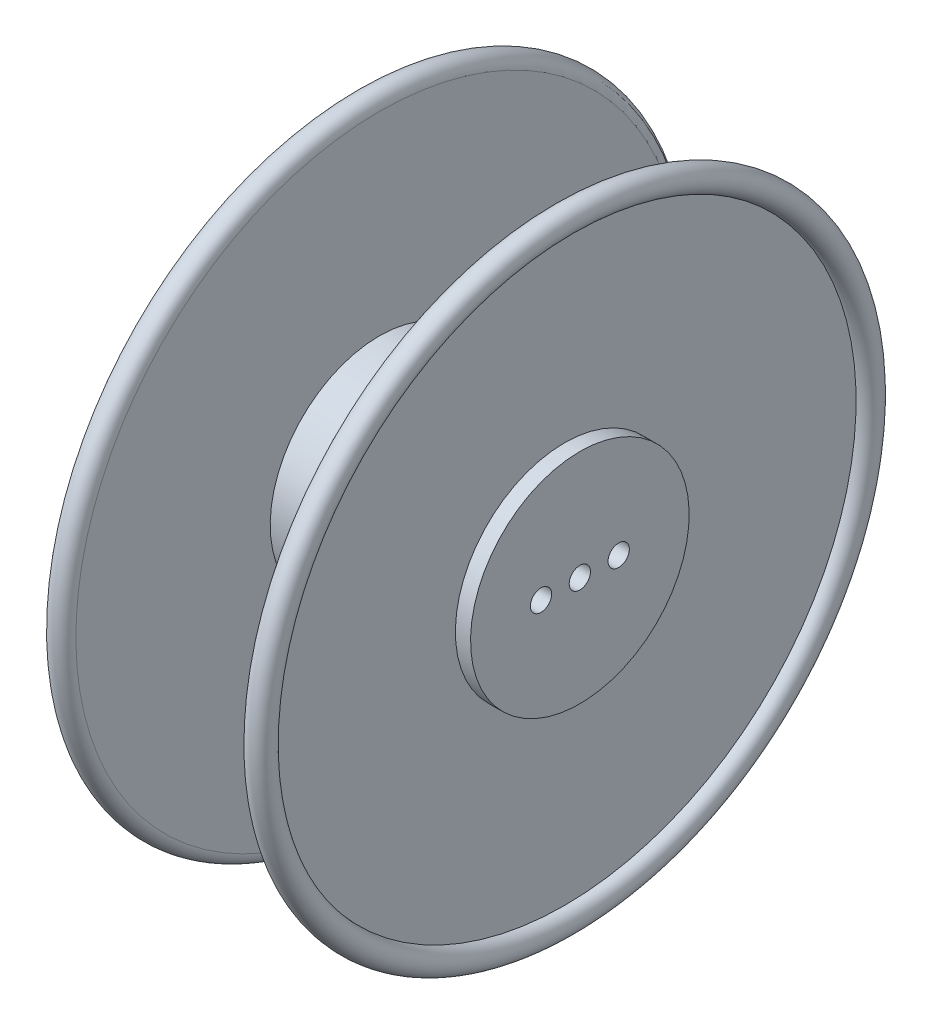
ISO-10303-21;
HEADER;
FILE_DESCRIPTION(('STEP AP214'),'2;1');
FILE_NAME('part.step','',(''),(''),'','','');
FILE_SCHEMA(('AUTOMOTIVE_DESIGN { 1 0 10303 214 1 1 1 1 }'));
ENDSEC;
DATA;
#1=APPLICATION_CONTEXT('core data for automotive mechanical design processes');
#2=APPLICATION_PROTOCOL_DEFINITION('international standard','automotive_design',2000,#1);
#3=PRODUCT_CONTEXT('',#1,'mechanical');
#4=PRODUCT('Part','Part','',(#3));
#5=PRODUCT_RELATED_PRODUCT_CATEGORY('part','',(#4));
#6=PRODUCT_DEFINITION_FORMATION('','',#4);
#7=PRODUCT_DEFINITION_CONTEXT('part definition',#1,'design');
#8=PRODUCT_DEFINITION('design','',#6,#7);
#9=PRODUCT_DEFINITION_SHAPE('','',#8);
#10=(LENGTH_UNIT() NAMED_UNIT(*) SI_UNIT(.MILLI.,.METRE.));
#11=(NAMED_UNIT(*) PLANE_ANGLE_UNIT() SI_UNIT($,.RADIAN.));
#12=(NAMED_UNIT(*) SI_UNIT($,.STERADIAN.) SOLID_ANGLE_UNIT());
#13=UNCERTAINTY_MEASURE_WITH_UNIT(LENGTH_MEASURE(1.E-05),#10,'distance_accuracy_value','');
#14=(GEOMETRIC_REPRESENTATION_CONTEXT(3) GLOBAL_UNCERTAINTY_ASSIGNED_CONTEXT((#13)) GLOBAL_UNIT_ASSIGNED_CONTEXT((#10,
#11,#12)) REPRESENTATION_CONTEXT('',''));
#15=CARTESIAN_POINT('',(0.,0.,0.));
#16=DIRECTION('',(0.,0.,1.));
#17=DIRECTION('',(1.,0.,0.));
#18=AXIS2_PLACEMENT_3D('',#15,#16,#17);
#19=CARTESIAN_POINT('',(19.9999999999994,-1.11022302462516E-13,0.));
#20=DIRECTION('',(1.,0.,0.));
#21=DIRECTION('',(0.,1.,0.));
#22=AXIS2_PLACEMENT_3D('',#19,#20,#21);
#23=TOROIDAL_SURFACE('',#22,500.,20.);
#24=CARTESIAN_POINT('',(19.9999999999995,0.,0.));
#25=DIRECTION('',(1.,0.,0.));
#26=DIRECTION('',(0.,1.,0.));
#27=AXIS2_PLACEMENT_3D('',#24,#25,#26);
#28=CIRCLE('',#27,480.);
#29=CARTESIAN_POINT('',(20.0000000000001,480.,0.));
#30=VERTEX_POINT('',#29);
#31=EDGE_CURVE('E72',#30,#30,#28,.T.);
#32=ORIENTED_EDGE('',*,*,#31,.F.);
#33=EDGE_LOOP('',(#32));
#34=FACE_BOUND('',#33,.T.);
#35=CARTESIAN_POINT('',(-6.17561557447743E-13,0.,0.));
#36=DIRECTION('',(1.,0.,0.));
#37=DIRECTION('',(0.,1.,0.));
#38=AXIS2_PLACEMENT_3D('',#35,#36,#37);
#39=CIRCLE('',#38,500.);
#40=CARTESIAN_POINT('',(0.,500.,0.));
#41=VERTEX_POINT('',#40);
#42=EDGE_CURVE('E10',#41,#41,#39,.T.);
#43=ORIENTED_EDGE('',*,*,#42,.T.);
#44=EDGE_LOOP('',(#43));
#45=FACE_BOUND('',#44,.T.);
#46=ADVANCED_FACE('F38',(#34,#45),#23,.T.);
#47=CARTESIAN_POINT('',(-4.19417587080614E-13,0.,0.));
#48=DIRECTION('',(1.,0.,0.));
#49=DIRECTION('',(0.,1.,0.));
#50=AXIS2_PLACEMENT_3D('',#47,#48,#49);
#51=PLANE('',#50);
#52=ORIENTED_EDGE('',*,*,#42,.F.);
#53=EDGE_LOOP('',(#52));
#54=FACE_BOUND('',#53,.T.);
#55=CARTESIAN_POINT('',(-2.22044604925031E-13,0.,0.));
#56=DIRECTION('',(1.,0.,0.));
#57=DIRECTION('',(0.,1.,0.));
#58=AXIS2_PLACEMENT_3D('',#55,#56,#57);
#59=CIRCLE('',#58,180.);
#60=CARTESIAN_POINT('',(0.,180.,0.));
#61=VERTEX_POINT('',#60);
#62=EDGE_CURVE('E44',#61,#61,#59,.T.);
#63=ORIENTED_EDGE('',*,*,#62,.T.);
#64=EDGE_LOOP('',(#63));
#65=FACE_BOUND('',#64,.T.);
#66=ADVANCED_FACE('F128',(#54,#65),#51,.F.);
#67=CARTESIAN_POINT('',(45.0000000000001,0.,0.));
#68=DIRECTION('',(1.,0.,0.));
#69=DIRECTION('',(0.,1.,0.));
#70=AXIS2_PLACEMENT_3D('',#67,#68,#69);
#71=CYLINDRICAL_SURFACE('',#70,180.);
#72=ORIENTED_EDGE('',*,*,#62,.F.);
#73=EDGE_LOOP('',(#72));
#74=FACE_BOUND('',#73,.T.);
#75=CARTESIAN_POINT('',(-285.,3.51570624464632E-13,0.));
#76=DIRECTION('',(1.,0.,0.));
#77=DIRECTION('',(0.,1.,0.));
#78=AXIS2_PLACEMENT_3D('',#75,#76,#77);
#79=CIRCLE('',#78,180.);
#80=CARTESIAN_POINT('',(-285.,180.,0.));
#81=VERTEX_POINT('',#80);
#82=EDGE_CURVE('E48',#81,#81,#79,.T.);
#83=ORIENTED_EDGE('',*,*,#82,.T.);
#84=EDGE_LOOP('',(#83));
#85=FACE_BOUND('',#84,.T.);
#86=ADVANCED_FACE('F132',(#74,#85),#71,.T.);
#87=CARTESIAN_POINT('',(-285.,0.,0.));
#88=DIRECTION('',(1.,0.,0.));
#89=DIRECTION('',(0.,1.,0.));
#90=AXIS2_PLACEMENT_3D('',#87,#88,#89);
#91=PLANE('',#90);
#92=CARTESIAN_POINT('',(-285.,3.51570624464633E-13,0.));
#93=DIRECTION('',(1.,0.,0.));
#94=DIRECTION('',(0.,1.,0.));
#95=AXIS2_PLACEMENT_3D('',#92,#93,#94);
#96=CIRCLE('',#95,500.);
#97=CARTESIAN_POINT('',(-285.,500.,0.));
#98=VERTEX_POINT('',#97);
#99=EDGE_CURVE('E52',#98,#98,#96,.T.);
#100=ORIENTED_EDGE('',*,*,#99,.T.);
#101=EDGE_LOOP('',(#100));
#102=FACE_BOUND('',#101,.T.);
#103=ORIENTED_EDGE('',*,*,#82,.F.);
#104=EDGE_LOOP('',(#103));
#105=FACE_BOUND('',#104,.T.);
#106=ADVANCED_FACE('F137',(#102,#105),#91,.T.);
#107=CARTESIAN_POINT('',(-305.000000000001,3.33066907387547E-13,0.));
#108=DIRECTION('',(1.,0.,0.));
#109=DIRECTION('',(0.,1.,0.));
#110=AXIS2_PLACEMENT_3D('',#107,#108,#109);
#111=TOROIDAL_SURFACE('',#110,500.,20.0000000000001);
#112=CARTESIAN_POINT('',(-305.000000000001,3.76242247234081E-13,0.));
#113=DIRECTION('',(1.,0.,0.));
#114=DIRECTION('',(0.,1.,0.));
#115=AXIS2_PLACEMENT_3D('',#112,#113,#114);
#116=CIRCLE('',#115,480.);
#117=CARTESIAN_POINT('',(-305.,480.,0.));
#118=VERTEX_POINT('',#117);
#119=EDGE_CURVE('E57',#118,#118,#116,.T.);
#120=ORIENTED_EDGE('',*,*,#119,.T.);
#121=EDGE_LOOP('',(#120));
#122=FACE_BOUND('',#121,.T.);
#123=ORIENTED_EDGE('',*,*,#99,.F.);
#124=EDGE_LOOP('',(#123));
#125=FACE_BOUND('',#124,.T.);
#126=ADVANCED_FACE('F143',(#122,#125),#111,.T.);
#127=CARTESIAN_POINT('',(-305.,0.,0.));
#128=DIRECTION('',(-1.,0.,0.));
#129=DIRECTION('',(0.,-1.,0.));
#130=AXIS2_PLACEMENT_3D('',#127,#128,#129);
#131=PLANE('',#130);
#132=CARTESIAN_POINT('',(-305.,3.7624224723408E-13,0.));
#133=DIRECTION('',(1.,0.,0.));
#134=DIRECTION('',(0.,1.,0.));
#135=AXIS2_PLACEMENT_3D('',#132,#133,#134);
#136=CIRCLE('',#135,180.);
#137=CARTESIAN_POINT('',(-305.,180.,0.));
#138=VERTEX_POINT('',#137);
#139=EDGE_CURVE('E60',#138,#138,#136,.T.);
#140=ORIENTED_EDGE('',*,*,#139,.T.);
#141=EDGE_LOOP('',(#140));
#142=FACE_BOUND('',#141,.T.);
#143=ORIENTED_EDGE('',*,*,#119,.F.);
#144=EDGE_LOOP('',(#143));
#145=FACE_BOUND('',#144,.T.);
#146=ADVANCED_FACE('F147',(#142,#145),#131,.T.);
#147=CARTESIAN_POINT('',(45.0000000000001,0.,0.));
#148=DIRECTION('',(1.,0.,0.));
#149=DIRECTION('',(0.,1.,0.));
#150=AXIS2_PLACEMENT_3D('',#147,#148,#149);
#151=CYLINDRICAL_SURFACE('',#150,180.);
#152=CARTESIAN_POINT('',(-330.,4.0708177569589E-13,0.));
#153=DIRECTION('',(1.,0.,0.));
#154=DIRECTION('',(0.,1.,0.));
#155=AXIS2_PLACEMENT_3D('',#152,#153,#154);
#156=CIRCLE('',#155,180.);
#157=CARTESIAN_POINT('',(-330.,180.,0.));
#158=VERTEX_POINT('',#157);
#159=EDGE_CURVE('E63',#158,#158,#156,.T.);
#160=ORIENTED_EDGE('',*,*,#159,.T.);
#161=EDGE_LOOP('',(#160));
#162=FACE_BOUND('',#161,.T.);
#163=ORIENTED_EDGE('',*,*,#139,.F.);
#164=EDGE_LOOP('',(#163));
#165=FACE_BOUND('',#164,.T.);
#166=ADVANCED_FACE('F151',(#162,#165),#151,.T.);
#167=CARTESIAN_POINT('',(-330.,0.,0.));
#168=DIRECTION('',(-1.,0.,0.));
#169=DIRECTION('',(0.,-1.,0.));
#170=AXIS2_PLACEMENT_3D('',#167,#168,#169);
#171=PLANE('',#170);
#172=CARTESIAN_POINT('',(-330.000000000001,4.0708177569589E-13,0.));
#173=DIRECTION('',(1.,0.,0.));
#174=DIRECTION('',(0.,1.,0.));
#175=AXIS2_PLACEMENT_3D('',#172,#173,#174);
#176=CIRCLE('',#175,17.5);
#177=CARTESIAN_POINT('',(-330.,17.5000000000004,0.));
#178=VERTEX_POINT('',#177);
#179=EDGE_CURVE('E75',#178,#178,#176,.T.);
#180=ORIENTED_EDGE('',*,*,#179,.T.);
#181=EDGE_LOOP('',(#180));
#182=FACE_BOUND('',#181,.T.);
#183=ORIENTED_EDGE('',*,*,#159,.F.);
#184=EDGE_LOOP('',(#183));
#185=FACE_BOUND('',#184,.T.);
#186=ADVANCED_FACE('F107',(#182,#185),#171,.T.);
#187=CARTESIAN_POINT('',(45.,0.,0.));
#188=DIRECTION('',(-1.,0.,0.));
#189=DIRECTION('',(0.,-1.,0.));
#190=AXIS2_PLACEMENT_3D('',#187,#188,#189);
#191=PLANE('',#190);
#192=CARTESIAN_POINT('',(45.,0.,-64.));
#193=DIRECTION('',(1.,0.,0.));
#194=DIRECTION('',(0.,1.,0.));
#195=AXIS2_PLACEMENT_3D('',#192,#193,#194);
#196=CIRCLE('',#195,17.5);
#197=CARTESIAN_POINT('',(45.,17.5,-64.));
#198=VERTEX_POINT('',#197);
#199=EDGE_CURVE('E88',#198,#198,#196,.T.);
#200=ORIENTED_EDGE('',*,*,#199,.F.);
#201=EDGE_LOOP('',(#200));
#202=FACE_BOUND('',#201,.T.);
#203=CARTESIAN_POINT('',(45.,0.,64.));
#204=DIRECTION('',(1.,0.,0.));
#205=DIRECTION('',(0.,1.,0.));
#206=AXIS2_PLACEMENT_3D('',#203,#204,#205);
#207=CIRCLE('',#206,17.5);
#208=CARTESIAN_POINT('',(45.,17.4999999999999,64.));
#209=VERTEX_POINT('',#208);
#210=EDGE_CURVE('E82',#209,#209,#207,.T.);
#211=ORIENTED_EDGE('',*,*,#210,.F.);
#212=EDGE_LOOP('',(#211));
#213=FACE_BOUND('',#212,.T.);
#214=CARTESIAN_POINT('',(45.,0.,0.));
#215=DIRECTION('',(1.,0.,0.));
#216=DIRECTION('',(0.,1.,0.));
#217=AXIS2_PLACEMENT_3D('',#214,#215,#216);
#218=CIRCLE('',#217,17.5);
#219=CARTESIAN_POINT('',(45.,17.5,0.));
#220=VERTEX_POINT('',#219);
#221=EDGE_CURVE('E76',#220,#220,#218,.T.);
#222=ORIENTED_EDGE('',*,*,#221,.F.);
#223=EDGE_LOOP('',(#222));
#224=FACE_BOUND('',#223,.T.);
#225=CARTESIAN_POINT('',(44.9999999999999,0.,0.));
#226=DIRECTION('',(1.,0.,0.));
#227=DIRECTION('',(0.,1.,0.));
#228=AXIS2_PLACEMENT_3D('',#225,#226,#227);
#229=CIRCLE('',#228,180.);
#230=CARTESIAN_POINT('',(45.0000000000001,180.,0.));
#231=VERTEX_POINT('',#230);
#232=EDGE_CURVE('E66',#231,#231,#229,.T.);
#233=ORIENTED_EDGE('',*,*,#232,.T.);
#234=EDGE_LOOP('',(#233));
#235=FACE_BOUND('',#234,.T.);
#236=ADVANCED_FACE('F103',(#202,#213,#224,#235),#191,.F.);
#237=CARTESIAN_POINT('',(45.0000000000001,0.,0.));
#238=DIRECTION('',(1.,0.,0.));
#239=DIRECTION('',(0.,1.,0.));
#240=AXIS2_PLACEMENT_3D('',#237,#238,#239);
#241=CYLINDRICAL_SURFACE('',#240,180.);
#242=ORIENTED_EDGE('',*,*,#232,.F.);
#243=EDGE_LOOP('',(#242));
#244=FACE_BOUND('',#243,.T.);
#245=CARTESIAN_POINT('',(19.9999999999999,0.,0.));
#246=DIRECTION('',(1.,0.,0.));
#247=DIRECTION('',(0.,1.,0.));
#248=AXIS2_PLACEMENT_3D('',#245,#246,#247);
#249=CIRCLE('',#248,180.);
#250=CARTESIAN_POINT('',(20.0000000000001,180.,0.));
#251=VERTEX_POINT('',#250);
#252=EDGE_CURVE('E69',#251,#251,#249,.T.);
#253=ORIENTED_EDGE('',*,*,#252,.T.);
#254=EDGE_LOOP('',(#253));
#255=FACE_BOUND('',#254,.T.);
#256=ADVANCED_FACE('F106',(#244,#255),#241,.T.);
#257=CARTESIAN_POINT('',(19.9999999999997,0.,0.));
#258=DIRECTION('',(-1.,0.,0.));
#259=DIRECTION('',(0.,-1.,0.));
#260=AXIS2_PLACEMENT_3D('',#257,#258,#259);
#261=PLANE('',#260);
#262=ORIENTED_EDGE('',*,*,#252,.F.);
#263=EDGE_LOOP('',(#262));
#264=FACE_BOUND('',#263,.T.);
#265=ORIENTED_EDGE('',*,*,#31,.T.);
#266=EDGE_LOOP('',(#265));
#267=FACE_BOUND('',#266,.T.);
#268=ADVANCED_FACE('F117',(#264,#267),#261,.F.);
#269=CARTESIAN_POINT('',(-330.000000000001,4.0708177569589E-13,0.));
#270=DIRECTION('',(1.,0.,0.));
#271=DIRECTION('',(0.,1.,0.));
#272=AXIS2_PLACEMENT_3D('',#269,#270,#271);
#273=CYLINDRICAL_SURFACE('',#272,17.5);
#274=CARTESIAN_POINT('',(-330.,17.5000000000004,0.));
#275=CARTESIAN_POINT('',(-326.09375,17.5000000000004,0.));
#276=CARTESIAN_POINT('',(-322.1875,17.5000000000004,0.));
#277=CARTESIAN_POINT('',(-314.375,17.5000000000004,0.));
#278=CARTESIAN_POINT('',(-310.46875,17.5000000000004,0.));
#279=CARTESIAN_POINT('',(-302.65625,17.5000000000004,0.));
#280=CARTESIAN_POINT('',(-298.75,17.5000000000004,0.));
#281=CARTESIAN_POINT('',(-290.9375,17.5000000000004,0.));
#282=CARTESIAN_POINT('',(-287.03125,17.5000000000004,0.));
#283=CARTESIAN_POINT('',(-279.21875,17.5000000000003,0.));
#284=CARTESIAN_POINT('',(-275.3125,17.5000000000003,0.));
#285=CARTESIAN_POINT('',(-267.5,17.5000000000003,0.));
#286=CARTESIAN_POINT('',(-263.59375,17.5000000000003,0.));
#287=CARTESIAN_POINT('',(-255.78125,17.5000000000003,0.));
#288=CARTESIAN_POINT('',(-251.875,17.5000000000003,0.));
#289=CARTESIAN_POINT('',(-244.0625,17.5000000000003,0.));
#290=CARTESIAN_POINT('',(-240.15625,17.5000000000003,0.));
#291=CARTESIAN_POINT('',(-232.34375,17.5000000000003,0.));
#292=CARTESIAN_POINT('',(-228.4375,17.5000000000003,0.));
#293=CARTESIAN_POINT('',(-220.625,17.5000000000003,0.));
#294=CARTESIAN_POINT('',(-216.71875,17.5000000000003,0.));
#295=CARTESIAN_POINT('',(-208.90625,17.5000000000003,0.));
#296=CARTESIAN_POINT('',(-205.,17.5000000000003,0.));
#297=CARTESIAN_POINT('',(-197.1875,17.5000000000002,0.));
#298=CARTESIAN_POINT('',(-193.28125,17.5000000000002,0.));
#299=CARTESIAN_POINT('',(-185.46875,17.5000000000002,0.));
#300=CARTESIAN_POINT('',(-181.5625,17.5000000000002,0.));
#301=CARTESIAN_POINT('',(-173.75,17.5000000000002,0.));
#302=CARTESIAN_POINT('',(-169.84375,17.5000000000002,0.));
#303=CARTESIAN_POINT('',(-162.03125,17.5000000000002,0.));
#304=CARTESIAN_POINT('',(-158.125,17.5000000000002,0.));
#305=CARTESIAN_POINT('',(-150.3125,17.5000000000002,0.));
#306=CARTESIAN_POINT('',(-146.40625,17.5000000000002,0.));
#307=CARTESIAN_POINT('',(-138.59375,17.5000000000002,0.));
#308=CARTESIAN_POINT('',(-134.6875,17.5000000000002,0.));
#309=CARTESIAN_POINT('',(-126.875,17.5000000000002,0.));
#310=CARTESIAN_POINT('',(-122.96875,17.5000000000002,0.));
#311=CARTESIAN_POINT('',(-115.15625,17.5000000000001,0.));
#312=CARTESIAN_POINT('',(-111.25,17.5000000000001,0.));
#313=CARTESIAN_POINT('',(-103.4375,17.5000000000001,0.));
#314=CARTESIAN_POINT('',(-99.5312500000002,17.5000000000001,0.));
#315=CARTESIAN_POINT('',(-91.7187500000002,17.5000000000001,0.));
#316=CARTESIAN_POINT('',(-87.8125000000002,17.5000000000001,0.));
#317=CARTESIAN_POINT('',(-80.0000000000002,17.5000000000001,0.));
#318=CARTESIAN_POINT('',(-76.0937500000002,17.5000000000001,0.));
#319=CARTESIAN_POINT('',(-68.2812500000002,17.5000000000001,0.));
#320=CARTESIAN_POINT('',(-64.3750000000002,17.5000000000001,0.));
#321=CARTESIAN_POINT('',(-56.5625000000002,17.5000000000001,0.));
#322=CARTESIAN_POINT('',(-52.6562500000001,17.5000000000001,0.));
#323=CARTESIAN_POINT('',(-44.8437500000001,17.5000000000001,0.));
#324=CARTESIAN_POINT('',(-40.9375000000001,17.5000000000001,0.));
#325=CARTESIAN_POINT('',(-33.1250000000001,17.5,0.));
#326=CARTESIAN_POINT('',(-29.2187500000001,17.5,0.));
#327=CARTESIAN_POINT('',(-21.4062500000001,17.5,0.));
#328=CARTESIAN_POINT('',(-17.5000000000001,17.5,0.));
#329=CARTESIAN_POINT('',(-9.68750000000007,17.5,0.));
#330=CARTESIAN_POINT('',(-5.78125000000007,17.5,0.));
#331=CARTESIAN_POINT('',(2.03124999999993,17.5,0.));
#332=CARTESIAN_POINT('',(5.93749999999993,17.5,0.));
#333=CARTESIAN_POINT('',(13.7499999999999,17.5,0.));
#334=CARTESIAN_POINT('',(17.6562499999999,17.5,0.));
#335=CARTESIAN_POINT('',(25.4687499999999,17.5,0.));
#336=CARTESIAN_POINT('',(29.375,17.5,0.));
#337=CARTESIAN_POINT('',(37.1875,17.5,0.));
#338=CARTESIAN_POINT('',(41.09375,17.5,0.));
#339=CARTESIAN_POINT('',(45.,17.5,0.));
#340=B_SPLINE_CURVE_WITH_KNOTS('',3,(#274,#275,#276,#277,#278,#279,#280,#281,#282,#283,#284,
#285,#286,#287,#288,#289,#290,#291,#292,#293,#294,#295,#296,#297,#298,#299,#300,#301,#302,#303,
#304,#305,#306,#307,#308,#309,#310,#311,#312,#313,#314,#315,#316,#317,#318,#319,#320,#321,#322,
#323,#324,#325,#326,#327,#328,#329,#330,#331,#332,#333,#334,#335,#336,#337,#338,#339),
.UNSPECIFIED.,.F.,.F.,(4,2,2,2,2,2,2,2,2,2,2,2,2,2,2,2,2,2,2,2,2,2,2,2,2,2,2,2,2,2,2,2,4),(0.,
11.71875,23.4375,35.15625,46.8750000000001,58.5937500000001,70.3125000000001,82.0312500000001,
93.7500000000001,105.46875,117.1875,128.90625,140.625,152.34375,164.0625,175.78125,187.5,
199.21875,210.9375,222.65625,234.375,246.09375,257.8125,269.53125,281.25,292.96875,304.6875,
316.40625,328.125,339.84375,351.5625,363.28125,375.),.UNSPECIFIED.);
#341=EDGE_CURVE('BSEAM123',#178,#220,#340,.T.);
#342=ORIENTED_EDGE('',*,*,#179,.F.);
#343=ORIENTED_EDGE('',*,*,#221,.T.);
#344=ORIENTED_EDGE('',*,*,#341,.T.);
#345=ORIENTED_EDGE('',*,*,#341,.F.);
#346=EDGE_LOOP('',(#342,#344,#343,#345));
#347=FACE_BOUND('',#346,.T.);
#348=ADVANCED_FACE('F123',(#347),#273,.F.);
#349=CARTESIAN_POINT('',(-5.00000000000001,0.,64.));
#350=DIRECTION('',(1.,0.,0.));
#351=DIRECTION('',(0.,1.,0.));
#352=AXIS2_PLACEMENT_3D('',#349,#350,#351);
#353=CYLINDRICAL_SURFACE('',#352,17.5);
#354=CARTESIAN_POINT('',(-5.00000000000001,0.,64.));
#355=DIRECTION('',(1.,0.,0.));
#356=DIRECTION('',(0.,1.,0.));
#357=AXIS2_PLACEMENT_3D('',#354,#355,#356);
#358=CIRCLE('',#357,17.5);
#359=CARTESIAN_POINT('',(-4.99999999999999,17.5,64.));
#360=VERTEX_POINT('',#359);
#361=EDGE_CURVE('E85',#360,#360,#358,.T.);
#362=ORIENTED_EDGE('',*,*,#361,.F.);
#363=EDGE_LOOP('',(#362));
#364=FACE_BOUND('',#363,.T.);
#365=ORIENTED_EDGE('',*,*,#210,.T.);
#366=EDGE_LOOP('',(#365));
#367=FACE_BOUND('',#366,.T.);
#368=ADVANCED_FACE('F161',(#364,#367),#353,.F.);
#369=CARTESIAN_POINT('',(-5.00000000000001,0.,0.));
#370=DIRECTION('',(1.,0.,0.));
#371=DIRECTION('',(0.,1.,0.));
#372=AXIS2_PLACEMENT_3D('',#369,#370,#371);
#373=PLANE('',#372);
#374=ORIENTED_EDGE('',*,*,#361,.T.);
#375=EDGE_LOOP('',(#374));
#376=FACE_BOUND('',#375,.T.);
#377=ADVANCED_FACE('F99',(#376),#373,.T.);
#378=CARTESIAN_POINT('',(-5.00000000000001,0.,-64.));
#379=DIRECTION('',(1.,0.,0.));
#380=DIRECTION('',(0.,1.,0.));
#381=AXIS2_PLACEMENT_3D('',#378,#379,#380);
#382=CYLINDRICAL_SURFACE('',#381,17.5);
#383=CARTESIAN_POINT('',(-5.00000000000001,0.,-64.));
#384=DIRECTION('',(1.,0.,0.));
#385=DIRECTION('',(0.,1.,0.));
#386=AXIS2_PLACEMENT_3D('',#383,#384,#385);
#387=CIRCLE('',#386,17.5);
#388=CARTESIAN_POINT('',(-4.99999999999999,17.5,-64.));
#389=VERTEX_POINT('',#388);
#390=EDGE_CURVE('E79',#389,#389,#387,.T.);
#391=ORIENTED_EDGE('',*,*,#390,.F.);
#392=EDGE_LOOP('',(#391));
#393=FACE_BOUND('',#392,.T.);
#394=ORIENTED_EDGE('',*,*,#199,.T.);
#395=EDGE_LOOP('',(#394));
#396=FACE_BOUND('',#395,.T.);
#397=ADVANCED_FACE('F96',(#393,#396),#382,.F.);
#398=CARTESIAN_POINT('',(-5.00000000000001,0.,0.));
#399=DIRECTION('',(1.,0.,0.));
#400=DIRECTION('',(0.,1.,0.));
#401=AXIS2_PLACEMENT_3D('',#398,#399,#400);
#402=PLANE('',#401);
#403=ORIENTED_EDGE('',*,*,#390,.T.);
#404=EDGE_LOOP('',(#403));
#405=FACE_BOUND('',#404,.T.);
#406=ADVANCED_FACE('F94',(#405),#402,.T.);
#407=CLOSED_SHELL('',(#46,#66,#86,#106,#126,#146,#166,#186,#236,#256,#268,#348,#368,#377,#397,#406));
#408=MANIFOLD_SOLID_BREP('B2',#407);
#409=ADVANCED_BREP_SHAPE_REPRESENTATION('',(#18,#408),#14);
#410=SHAPE_DEFINITION_REPRESENTATION(#9,#409);
ENDSEC;
END-ISO-10303-21;
